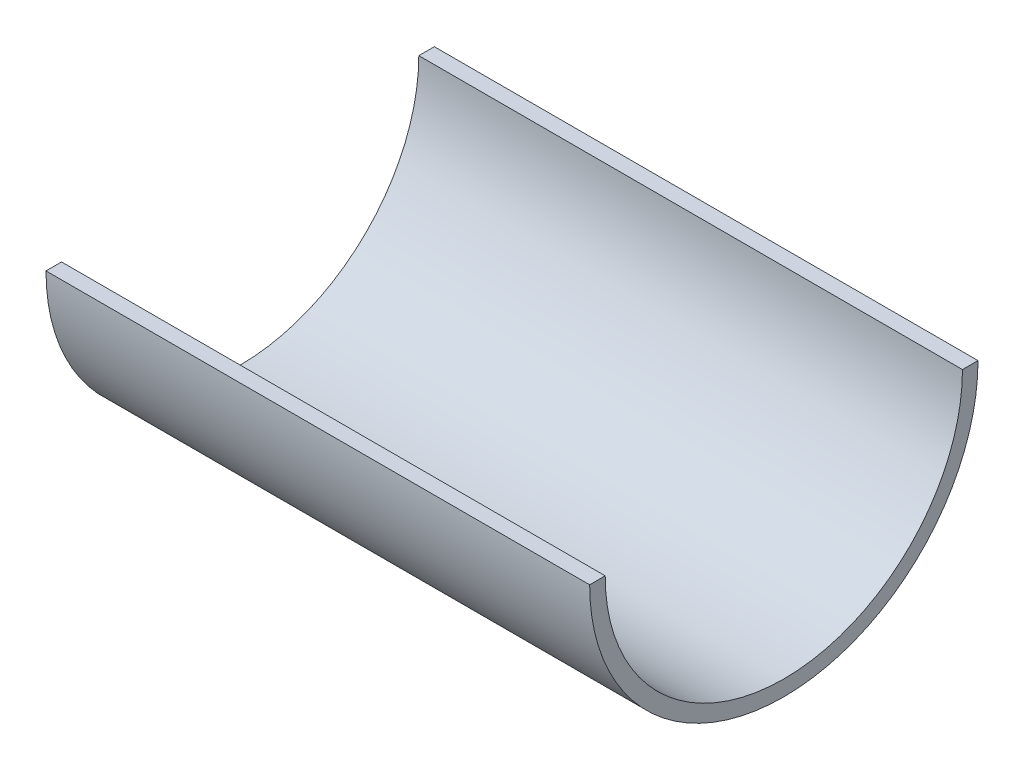
ISO-10303-21;
HEADER;
FILE_DESCRIPTION(('STEP AP214'),'2;1');
FILE_NAME('part.step','',(''),(''),'','','');
FILE_SCHEMA(('AUTOMOTIVE_DESIGN { 1 0 10303 214 1 1 1 1 }'));
ENDSEC;
DATA;
#1=APPLICATION_CONTEXT('core data for automotive mechanical design processes');
#2=APPLICATION_PROTOCOL_DEFINITION('international standard','automotive_design',2000,#1);
#3=PRODUCT_CONTEXT('',#1,'mechanical');
#4=PRODUCT('Part','Part','',(#3));
#5=PRODUCT_RELATED_PRODUCT_CATEGORY('part','',(#4));
#6=PRODUCT_DEFINITION_FORMATION('','',#4);
#7=PRODUCT_DEFINITION_CONTEXT('part definition',#1,'design');
#8=PRODUCT_DEFINITION('design','',#6,#7);
#9=PRODUCT_DEFINITION_SHAPE('','',#8);
#10=(LENGTH_UNIT() NAMED_UNIT(*) SI_UNIT(.MILLI.,.METRE.));
#11=(NAMED_UNIT(*) PLANE_ANGLE_UNIT() SI_UNIT($,.RADIAN.));
#12=(NAMED_UNIT(*) SI_UNIT($,.STERADIAN.) SOLID_ANGLE_UNIT());
#13=UNCERTAINTY_MEASURE_WITH_UNIT(LENGTH_MEASURE(1.E-05),#10,'distance_accuracy_value','');
#14=(GEOMETRIC_REPRESENTATION_CONTEXT(3) GLOBAL_UNCERTAINTY_ASSIGNED_CONTEXT((#13)) GLOBAL_UNIT_ASSIGNED_CONTEXT((#10,
#11,#12)) REPRESENTATION_CONTEXT('',''));
#15=CARTESIAN_POINT('',(0.,0.,0.));
#16=DIRECTION('',(0.,0.,1.));
#17=DIRECTION('',(1.,0.,0.));
#18=AXIS2_PLACEMENT_3D('',#15,#16,#17);
#19=CARTESIAN_POINT('',(100.,-29.9999999999998,0.));
#20=DIRECTION('',(-1.,0.,0.));
#21=DIRECTION('',(0.,-1.,0.));
#22=AXIS2_PLACEMENT_3D('',#19,#20,#21);
#23=CYLINDRICAL_SURFACE('',#22,25.);
#24=CARTESIAN_POINT('',(100.,-29.9999999999998,0.));
#25=DIRECTION('',(1.,0.,0.));
#26=DIRECTION('',(0.,1.,0.));
#27=AXIS2_PLACEMENT_3D('',#24,#25,#26);
#28=CIRCLE('',#27,25.);
#29=CARTESIAN_POINT('',(100.,-29.9999999999997,25.));
#30=VERTEX_POINT('',#29);
#31=CARTESIAN_POINT('',(100.,-29.9999999999997,-25.));
#32=VERTEX_POINT('',#31);
#33=EDGE_CURVE('E126',#30,#32,#28,.T.);
#34=ORIENTED_EDGE('',*,*,#33,.F.);
#35=DIRECTION('',(1.,0.,0.));
#36=VECTOR('',#35,1.);
#37=CARTESIAN_POINT('',(13.0000000000001,-30.0000000000001,25.));
#38=LINE('',#37,#36);
#39=CARTESIAN_POINT('',(30.,-29.9999999999999,25.));
#40=VERTEX_POINT('',#39);
#41=EDGE_CURVE('E122',#40,#30,#38,.T.);
#42=ORIENTED_EDGE('',*,*,#41,.F.);
#43=CARTESIAN_POINT('',(30.0000000000001,-30.,0.));
#44=DIRECTION('',(1.,0.,0.));
#45=DIRECTION('',(0.,1.,0.));
#46=AXIS2_PLACEMENT_3D('',#43,#44,#45);
#47=CIRCLE('',#46,25.);
#48=CARTESIAN_POINT('',(30.,-30.,-25.));
#49=VERTEX_POINT('',#48);
#50=EDGE_CURVE('E112',#40,#49,#47,.T.);
#51=ORIENTED_EDGE('',*,*,#50,.T.);
#52=DIRECTION('',(1.,0.,0.));
#53=VECTOR('',#52,1.);
#54=CARTESIAN_POINT('',(13.0000000000001,-30.,-25.));
#55=LINE('',#54,#53);
#56=EDGE_CURVE('E115',#49,#32,#55,.T.);
#57=ORIENTED_EDGE('',*,*,#56,.T.);
#58=EDGE_LOOP('',(#34,#42,#51,#57));
#59=FACE_BOUND('',#58,.T.);
#60=ADVANCED_FACE('F72',(#59),#23,.T.);
#61=CARTESIAN_POINT('',(100.,-29.9999999999998,0.));
#62=DIRECTION('',(1.,0.,0.));
#63=DIRECTION('',(0.,1.,0.));
#64=AXIS2_PLACEMENT_3D('',#61,#62,#63);
#65=PLANE('',#64);
#66=DIRECTION('',(0.,0.,-1.));
#67=VECTOR('',#66,1.);
#68=CARTESIAN_POINT('',(100.,-29.9999999999997,25.));
#69=LINE('',#68,#67);
#70=CARTESIAN_POINT('',(100.,-29.9999999999997,23.));
#71=VERTEX_POINT('',#70);
#72=EDGE_CURVE('E143',#30,#71,#69,.T.);
#73=ORIENTED_EDGE('',*,*,#72,.F.);
#74=ORIENTED_EDGE('',*,*,#33,.T.);
#75=CARTESIAN_POINT('',(100.,-29.9999999999997,-23.));
#76=VERTEX_POINT('',#75);
#77=EDGE_CURVE('E117',#76,#32,#69,.T.);
#78=ORIENTED_EDGE('',*,*,#77,.F.);
#79=CARTESIAN_POINT('',(100.,-29.9999999999998,0.));
#80=DIRECTION('',(1.,0.,0.));
#81=DIRECTION('',(0.,1.,0.));
#82=AXIS2_PLACEMENT_3D('',#79,#80,#81);
#83=CIRCLE('',#82,23.);
#84=EDGE_CURVE('E127',#71,#76,#83,.T.);
#85=ORIENTED_EDGE('',*,*,#84,.F.);
#86=EDGE_LOOP('',(#73,#74,#78,#85));
#87=FACE_BOUND('',#86,.T.);
#88=ADVANCED_FACE('F157',(#87),#65,.T.);
#89=CARTESIAN_POINT('',(100.,-29.9999999999998,0.));
#90=DIRECTION('',(-1.,0.,0.));
#91=DIRECTION('',(0.,-1.,0.));
#92=AXIS2_PLACEMENT_3D('',#89,#90,#91);
#93=CYLINDRICAL_SURFACE('',#92,23.);
#94=DIRECTION('',(-1.,0.,0.));
#95=VECTOR('',#94,1.);
#96=CARTESIAN_POINT('',(100.,-29.9999999999997,23.));
#97=LINE('',#96,#95);
#98=CARTESIAN_POINT('',(30.,-29.9999999999999,23.));
#99=VERTEX_POINT('',#98);
#100=EDGE_CURVE('E80',#71,#99,#97,.T.);
#101=ORIENTED_EDGE('',*,*,#100,.F.);
#102=ORIENTED_EDGE('',*,*,#84,.T.);
#103=DIRECTION('',(-1.,0.,0.));
#104=VECTOR('',#103,1.);
#105=CARTESIAN_POINT('',(100.,-29.9999999999997,-23.));
#106=LINE('',#105,#104);
#107=CARTESIAN_POINT('',(30.0000000000001,-29.9999999999999,-23.));
#108=VERTEX_POINT('',#107);
#109=EDGE_CURVE('E93',#108,#76,#106,.F.);
#110=ORIENTED_EDGE('',*,*,#109,.F.);
#111=CARTESIAN_POINT('',(30.0000000000001,-30.,0.));
#112=DIRECTION('',(-1.,0.,0.));
#113=DIRECTION('',(0.,-1.,0.));
#114=AXIS2_PLACEMENT_3D('',#111,#112,#113);
#115=CIRCLE('',#114,23.);
#116=EDGE_CURVE('E87',#99,#108,#115,.F.);
#117=ORIENTED_EDGE('',*,*,#116,.F.);
#118=EDGE_LOOP('',(#101,#102,#110,#117));
#119=FACE_BOUND('',#118,.T.);
#120=ADVANCED_FACE('F146',(#119),#93,.F.);
#121=CARTESIAN_POINT('',(13.0000000000001,-30.0000000000001,25.));
#122=DIRECTION('',(0.,-1.,0.));
#123=DIRECTION('',(1.,0.,0.));
#124=AXIS2_PLACEMENT_3D('',#121,#122,#123);
#125=PLANE('',#124);
#126=ORIENTED_EDGE('',*,*,#100,.T.);
#127=DIRECTION('',(0.,0.,1.));
#128=VECTOR('',#127,1.);
#129=CARTESIAN_POINT('',(30.,-30.,25.));
#130=LINE('',#129,#128);
#131=EDGE_CURVE('E141',#99,#40,#130,.T.);
#132=ORIENTED_EDGE('',*,*,#131,.T.);
#133=ORIENTED_EDGE('',*,*,#41,.T.);
#134=ORIENTED_EDGE('',*,*,#72,.T.);
#135=EDGE_LOOP('',(#126,#132,#133,#134));
#136=FACE_BOUND('',#135,.T.);
#137=ADVANCED_FACE('F140',(#136),#125,.F.);
#138=ORIENTED_EDGE('',*,*,#56,.F.);
#139=DIRECTION('',(0.,0.,1.));
#140=VECTOR('',#139,1.);
#141=CARTESIAN_POINT('',(30.,-30.,25.));
#142=LINE('',#141,#140);
#143=EDGE_CURVE('E12',#49,#108,#142,.T.);
#144=ORIENTED_EDGE('',*,*,#143,.T.);
#145=ORIENTED_EDGE('',*,*,#109,.T.);
#146=ORIENTED_EDGE('',*,*,#77,.T.);
#147=EDGE_LOOP('',(#138,#144,#145,#146));
#148=FACE_BOUND('',#147,.T.);
#149=ADVANCED_FACE('F116',(#148),#125,.F.);
#150=CARTESIAN_POINT('',(30.,-69.,-25.));
#151=DIRECTION('',(1.,0.,0.));
#152=DIRECTION('',(0.,0.,-1.));
#153=AXIS2_PLACEMENT_3D('',#150,#151,#152);
#154=PLANE('',#153);
#155=ORIENTED_EDGE('',*,*,#116,.T.);
#156=ORIENTED_EDGE('',*,*,#143,.F.);
#157=ORIENTED_EDGE('',*,*,#50,.F.);
#158=ORIENTED_EDGE('',*,*,#131,.F.);
#159=EDGE_LOOP('',(#155,#156,#157,#158));
#160=FACE_BOUND('',#159,.T.);
#161=ADVANCED_FACE('F110',(#160),#154,.F.);
#162=CLOSED_SHELL('',(#60,#88,#120,#137,#149,#161));
#163=MANIFOLD_SOLID_BREP('B2',#162);
#164=ADVANCED_BREP_SHAPE_REPRESENTATION('',(#18,#163),#14);
#165=SHAPE_DEFINITION_REPRESENTATION(#9,#164);
ENDSEC;
END-ISO-10303-21;
